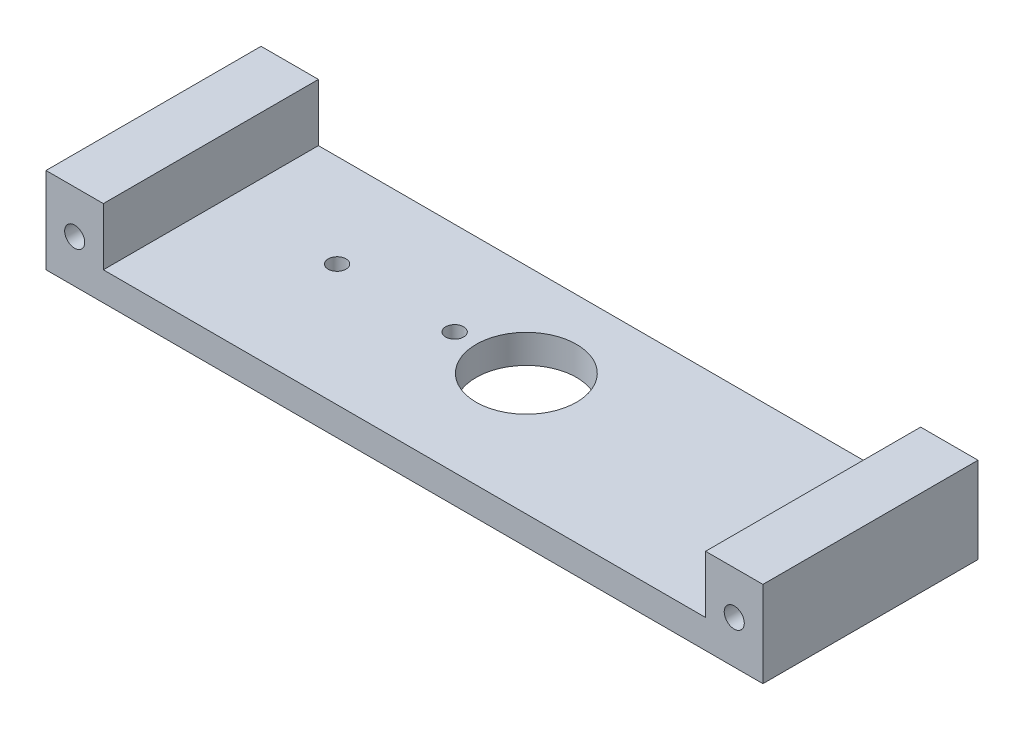
ISO-10303-21;
HEADER;
FILE_DESCRIPTION(('STEP AP214'),'2;1');
FILE_NAME('part.step','',(''),(''),'','','');
FILE_SCHEMA(('AUTOMOTIVE_DESIGN { 1 0 10303 214 1 1 1 1 }'));
ENDSEC;
DATA;
#1=APPLICATION_CONTEXT('core data for automotive mechanical design processes');
#2=APPLICATION_PROTOCOL_DEFINITION('international standard','automotive_design',2000,#1);
#3=PRODUCT_CONTEXT('',#1,'mechanical');
#4=PRODUCT('Part','Part','',(#3));
#5=PRODUCT_RELATED_PRODUCT_CATEGORY('part','',(#4));
#6=PRODUCT_DEFINITION_FORMATION('','',#4);
#7=PRODUCT_DEFINITION_CONTEXT('part definition',#1,'design');
#8=PRODUCT_DEFINITION('design','',#6,#7);
#9=PRODUCT_DEFINITION_SHAPE('','',#8);
#10=(LENGTH_UNIT() NAMED_UNIT(*) SI_UNIT(.MILLI.,.METRE.));
#11=(NAMED_UNIT(*) PLANE_ANGLE_UNIT() SI_UNIT($,.RADIAN.));
#12=(NAMED_UNIT(*) SI_UNIT($,.STERADIAN.) SOLID_ANGLE_UNIT());
#13=UNCERTAINTY_MEASURE_WITH_UNIT(LENGTH_MEASURE(1.E-05),#10,'distance_accuracy_value','');
#14=(GEOMETRIC_REPRESENTATION_CONTEXT(3) GLOBAL_UNCERTAINTY_ASSIGNED_CONTEXT((#13)) GLOBAL_UNIT_ASSIGNED_CONTEXT((#10,
#11,#12)) REPRESENTATION_CONTEXT('',''));
#15=CARTESIAN_POINT('',(0.,0.,0.));
#16=DIRECTION('',(0.,0.,1.));
#17=DIRECTION('',(1.,0.,0.));
#18=AXIS2_PLACEMENT_3D('',#15,#16,#17);
#19=CARTESIAN_POINT('',(0.,2.,0.));
#20=DIRECTION('',(0.,1.,0.));
#21=DIRECTION('',(0.,0.,1.));
#22=AXIS2_PLACEMENT_3D('',#19,#20,#21);
#23=PLANE('',#22);
#24=CARTESIAN_POINT('',(-53.0837928014307,2.,-8.1551724137931));
#25=DIRECTION('',(0.,1.,0.));
#26=DIRECTION('',(0.,0.,1.));
#27=AXIS2_PLACEMENT_3D('',#24,#25,#26);
#28=CIRCLE('',#27,0.625000000000001);
#29=CARTESIAN_POINT('',(-53.0837928014307,2.,-7.5301724137931));
#30=VERTEX_POINT('',#29);
#31=EDGE_CURVE('E243',#30,#30,#28,.T.);
#32=ORIENTED_EDGE('',*,*,#31,.F.);
#33=EDGE_LOOP('',(#32));
#34=FACE_BOUND('',#33,.T.);
#35=CARTESIAN_POINT('',(-44.8853811647955,2.,-8.1551724137931));
#36=DIRECTION('',(0.,1.,0.));
#37=DIRECTION('',(0.,0.,1.));
#38=AXIS2_PLACEMENT_3D('',#35,#36,#37);
#39=CIRCLE('',#38,0.625000000000001);
#40=CARTESIAN_POINT('',(-44.8853811647955,2.,-7.5301724137931));
#41=VERTEX_POINT('',#40);
#42=EDGE_CURVE('E237',#41,#41,#39,.T.);
#43=ORIENTED_EDGE('',*,*,#42,.F.);
#44=EDGE_LOOP('',(#43));
#45=FACE_BOUND('',#44,.T.);
#46=CARTESIAN_POINT('',(-39.8853811647955,2.,-8.1551724137931));
#47=DIRECTION('',(0.,1.,0.));
#48=DIRECTION('',(0.,0.,1.));
#49=AXIS2_PLACEMENT_3D('',#46,#47,#48);
#50=CIRCLE('',#49,3.49999999999999);
#51=CARTESIAN_POINT('',(-39.8853811647955,2.,-4.65517241379312));
#52=VERTEX_POINT('',#51);
#53=EDGE_CURVE('E184',#52,#52,#50,.T.);
#54=ORIENTED_EDGE('',*,*,#53,.F.);
#55=EDGE_LOOP('',(#54));
#56=FACE_BOUND('',#55,.T.);
#57=DIRECTION('',(1.,0.,0.));
#58=VECTOR('',#57,1.);
#59=CARTESIAN_POINT('',(-64.8853811647955,2.,0.344827586206898));
#60=LINE('',#59,#58);
#61=CARTESIAN_POINT('',(-60.8853811647955,2.,0.344827586206898));
#62=VERTEX_POINT('',#61);
#63=CARTESIAN_POINT('',(-18.8853811647955,2.,0.344827586206898));
#64=VERTEX_POINT('',#63);
#65=EDGE_CURVE('E119',#62,#64,#60,.T.);
#66=ORIENTED_EDGE('',*,*,#65,.T.);
#67=DIRECTION('',(0.,0.,1.));
#68=VECTOR('',#67,1.);
#69=CARTESIAN_POINT('',(-18.8853811647955,2.,-14.6551724137931));
#70=LINE('',#69,#68);
#71=CARTESIAN_POINT('',(-18.8853811647955,2.,-14.6551724137931));
#72=VERTEX_POINT('',#71);
#73=EDGE_CURVE('E108',#72,#64,#70,.T.);
#74=ORIENTED_EDGE('',*,*,#73,.F.);
#75=DIRECTION('',(-1.,0.,0.));
#76=VECTOR('',#75,1.);
#77=CARTESIAN_POINT('',(-64.8853811647955,2.,-14.6551724137931));
#78=LINE('',#77,#76);
#79=CARTESIAN_POINT('',(-60.8853811647955,2.,-14.6551724137931));
#80=VERTEX_POINT('',#79);
#81=EDGE_CURVE('E125',#72,#80,#78,.T.);
#82=ORIENTED_EDGE('',*,*,#81,.T.);
#83=DIRECTION('',(0.,0.,-1.));
#84=VECTOR('',#83,1.);
#85=CARTESIAN_POINT('',(-60.8853811647955,2.,-14.6551724137931));
#86=LINE('',#85,#84);
#87=EDGE_CURVE('E66',#62,#80,#86,.T.);
#88=ORIENTED_EDGE('',*,*,#87,.F.);
#89=EDGE_LOOP('',(#66,#74,#82,#88));
#90=FACE_BOUND('',#89,.T.);
#91=ADVANCED_FACE('F43',(#34,#45,#56,#90),#23,.T.);
#92=CARTESIAN_POINT('',(-14.8853811647955,2.,-14.6551724137931));
#93=DIRECTION('',(-1.,0.,0.));
#94=DIRECTION('',(0.,0.,1.));
#95=AXIS2_PLACEMENT_3D('',#92,#93,#94);
#96=PLANE('',#95);
#97=DIRECTION('',(0.,0.,-1.));
#98=VECTOR('',#97,1.);
#99=CARTESIAN_POINT('',(-14.8853811647955,0.,-14.6551724137931));
#100=LINE('',#99,#98);
#101=CARTESIAN_POINT('',(-14.8853811647955,0.,0.344827586206898));
#102=VERTEX_POINT('',#101);
#103=CARTESIAN_POINT('',(-14.8853811647955,0.,-14.6551724137931));
#104=VERTEX_POINT('',#103);
#105=EDGE_CURVE('E134',#102,#104,#100,.T.);
#106=ORIENTED_EDGE('',*,*,#105,.T.);
#107=DIRECTION('',(0.,-1.,0.));
#108=VECTOR('',#107,1.);
#109=CARTESIAN_POINT('',(-14.8853811647955,2.,-14.6551724137931));
#110=LINE('',#109,#108);
#111=CARTESIAN_POINT('',(-14.8853811647955,6.,-14.6551724137931));
#112=VERTEX_POINT('',#111);
#113=EDGE_CURVE('E11',#112,#104,#110,.T.);
#114=ORIENTED_EDGE('',*,*,#113,.F.);
#115=DIRECTION('',(0.,0.,-1.));
#116=VECTOR('',#115,1.);
#117=CARTESIAN_POINT('',(-14.8853811647955,6.,0.344827586206898));
#118=LINE('',#117,#116);
#119=CARTESIAN_POINT('',(-14.8853811647955,6.,0.344827586206898));
#120=VERTEX_POINT('',#119);
#121=EDGE_CURVE('E161',#120,#112,#118,.T.);
#122=ORIENTED_EDGE('',*,*,#121,.F.);
#123=DIRECTION('',(0.,-1.,0.));
#124=VECTOR('',#123,1.);
#125=CARTESIAN_POINT('',(-14.8853811647955,2.,0.344827586206898));
#126=LINE('',#125,#124);
#127=EDGE_CURVE('E124',#120,#102,#126,.T.);
#128=ORIENTED_EDGE('',*,*,#127,.T.);
#129=EDGE_LOOP('',(#106,#114,#122,#128));
#130=FACE_BOUND('',#129,.T.);
#131=ADVANCED_FACE('F45',(#130),#96,.F.);
#132=CARTESIAN_POINT('',(-64.8853811647955,2.,-14.6551724137931));
#133=DIRECTION('',(0.,0.,1.));
#134=DIRECTION('',(1.,0.,0.));
#135=AXIS2_PLACEMENT_3D('',#132,#133,#134);
#136=PLANE('',#135);
#137=CARTESIAN_POINT('',(-62.8853811647955,3.,-14.6551724137931));
#138=DIRECTION('',(0.,0.,-1.));
#139=DIRECTION('',(-1.,0.,0.));
#140=AXIS2_PLACEMENT_3D('',#137,#138,#139);
#141=CIRCLE('',#140,0.700000000000002);
#142=CARTESIAN_POINT('',(-63.5853811647955,3.,-14.6551724137931));
#143=VERTEX_POINT('',#142);
#144=EDGE_CURVE('E219',#143,#143,#141,.T.);
#145=ORIENTED_EDGE('',*,*,#144,.F.);
#146=EDGE_LOOP('',(#145));
#147=FACE_BOUND('',#146,.T.);
#148=CARTESIAN_POINT('',(-16.8853811647955,3.,-14.6551724137931));
#149=DIRECTION('',(0.,0.,-1.));
#150=DIRECTION('',(-1.,0.,0.));
#151=AXIS2_PLACEMENT_3D('',#148,#149,#150);
#152=CIRCLE('',#151,0.699999999999998);
#153=CARTESIAN_POINT('',(-17.5853811647955,3.,-14.6551724137931));
#154=VERTEX_POINT('',#153);
#155=EDGE_CURVE('E222',#154,#154,#152,.T.);
#156=ORIENTED_EDGE('',*,*,#155,.F.);
#157=EDGE_LOOP('',(#156));
#158=FACE_BOUND('',#157,.T.);
#159=DIRECTION('',(-1.,0.,0.));
#160=VECTOR('',#159,1.);
#161=CARTESIAN_POINT('',(-64.8853811647955,0.,-14.6551724137931));
#162=LINE('',#161,#160);
#163=CARTESIAN_POINT('',(-64.8853811647955,0.,-14.6551724137931));
#164=VERTEX_POINT('',#163);
#165=EDGE_CURVE('E137',#104,#164,#162,.T.);
#166=ORIENTED_EDGE('',*,*,#165,.T.);
#167=DIRECTION('',(0.,-1.,0.));
#168=VECTOR('',#167,1.);
#169=CARTESIAN_POINT('',(-64.8853811647955,2.,-14.6551724137931));
#170=LINE('',#169,#168);
#171=CARTESIAN_POINT('',(-64.8853811647955,6.,-14.6551724137931));
#172=VERTEX_POINT('',#171);
#173=EDGE_CURVE('E51',#172,#164,#170,.T.);
#174=ORIENTED_EDGE('',*,*,#173,.F.);
#175=DIRECTION('',(-1.,0.,0.));
#176=VECTOR('',#175,1.);
#177=CARTESIAN_POINT('',(-64.8853811647955,6.,-14.6551724137931));
#178=LINE('',#177,#176);
#179=CARTESIAN_POINT('',(-60.8853811647955,6.,-14.6551724137931));
#180=VERTEX_POINT('',#179);
#181=EDGE_CURVE('E173',#180,#172,#178,.T.);
#182=ORIENTED_EDGE('',*,*,#181,.F.);
#183=DIRECTION('',(0.,-1.,0.));
#184=VECTOR('',#183,1.);
#185=CARTESIAN_POINT('',(-60.8853811647955,6.,-14.6551724137931));
#186=LINE('',#185,#184);
#187=EDGE_CURVE('E181',#180,#80,#186,.T.);
#188=ORIENTED_EDGE('',*,*,#187,.T.);
#189=ORIENTED_EDGE('',*,*,#81,.F.);
#190=DIRECTION('',(0.,-1.,0.));
#191=VECTOR('',#190,1.);
#192=CARTESIAN_POINT('',(-18.8853811647955,6.,-14.6551724137931));
#193=LINE('',#192,#191);
#194=CARTESIAN_POINT('',(-18.8853811647955,6.,-14.6551724137931));
#195=VERTEX_POINT('',#194);
#196=EDGE_CURVE('E58',#195,#72,#193,.T.);
#197=ORIENTED_EDGE('',*,*,#196,.F.);
#198=DIRECTION('',(-1.,0.,0.));
#199=VECTOR('',#198,1.);
#200=CARTESIAN_POINT('',(-14.8853811647955,6.,-14.6551724137931));
#201=LINE('',#200,#199);
#202=EDGE_CURVE('E164',#112,#195,#201,.T.);
#203=ORIENTED_EDGE('',*,*,#202,.F.);
#204=ORIENTED_EDGE('',*,*,#113,.T.);
#205=EDGE_LOOP('',(#166,#174,#182,#188,#189,#197,#203,#204));
#206=FACE_BOUND('',#205,.T.);
#207=ADVANCED_FACE('F199',(#147,#158,#206),#136,.F.);
#208=CARTESIAN_POINT('',(-64.8853811647955,2.,-14.6551724137931));
#209=DIRECTION('',(1.,0.,0.));
#210=DIRECTION('',(0.,0.,-1.));
#211=AXIS2_PLACEMENT_3D('',#208,#209,#210);
#212=PLANE('',#211);
#213=DIRECTION('',(0.,0.,1.));
#214=VECTOR('',#213,1.);
#215=CARTESIAN_POINT('',(-64.8853811647955,0.,-14.6551724137931));
#216=LINE('',#215,#214);
#217=CARTESIAN_POINT('',(-64.8853811647955,0.,0.344827586206898));
#218=VERTEX_POINT('',#217);
#219=EDGE_CURVE('E140',#164,#218,#216,.T.);
#220=ORIENTED_EDGE('',*,*,#219,.T.);
#221=DIRECTION('',(0.,-1.,0.));
#222=VECTOR('',#221,1.);
#223=CARTESIAN_POINT('',(-64.8853811647955,2.,0.344827586206898));
#224=LINE('',#223,#222);
#225=CARTESIAN_POINT('',(-64.8853811647955,6.,0.344827586206898));
#226=VERTEX_POINT('',#225);
#227=EDGE_CURVE('E128',#226,#218,#224,.T.);
#228=ORIENTED_EDGE('',*,*,#227,.F.);
#229=DIRECTION('',(0.,0.,1.));
#230=VECTOR('',#229,1.);
#231=CARTESIAN_POINT('',(-64.8853811647955,6.,0.344827586206898));
#232=LINE('',#231,#230);
#233=EDGE_CURVE('E150',#172,#226,#232,.T.);
#234=ORIENTED_EDGE('',*,*,#233,.F.);
#235=ORIENTED_EDGE('',*,*,#173,.T.);
#236=EDGE_LOOP('',(#220,#228,#234,#235));
#237=FACE_BOUND('',#236,.T.);
#238=ADVANCED_FACE('F148',(#237),#212,.F.);
#239=CARTESIAN_POINT('',(-64.8853811647955,2.,0.344827586206898));
#240=DIRECTION('',(0.,0.,-1.));
#241=DIRECTION('',(-1.,0.,0.));
#242=AXIS2_PLACEMENT_3D('',#239,#240,#241);
#243=PLANE('',#242);
#244=CARTESIAN_POINT('',(-62.8853811647955,3.,0.344827586206898));
#245=DIRECTION('',(0.,0.,-1.));
#246=DIRECTION('',(-1.,0.,0.));
#247=AXIS2_PLACEMENT_3D('',#244,#245,#246);
#248=CIRCLE('',#247,0.700000000000002);
#249=CARTESIAN_POINT('',(-63.5853811647955,3.,0.344827586206898));
#250=VERTEX_POINT('',#249);
#251=EDGE_CURVE('E226',#250,#250,#248,.T.);
#252=ORIENTED_EDGE('',*,*,#251,.T.);
#253=EDGE_LOOP('',(#252));
#254=FACE_BOUND('',#253,.T.);
#255=CARTESIAN_POINT('',(-16.8853811647955,3.,0.344827586206898));
#256=DIRECTION('',(0.,0.,-1.));
#257=DIRECTION('',(-1.,0.,0.));
#258=AXIS2_PLACEMENT_3D('',#255,#256,#257);
#259=CIRCLE('',#258,0.699999999999998);
#260=CARTESIAN_POINT('',(-17.5853811647955,3.,0.344827586206898));
#261=VERTEX_POINT('',#260);
#262=EDGE_CURVE('E227',#261,#261,#259,.T.);
#263=ORIENTED_EDGE('',*,*,#262,.T.);
#264=EDGE_LOOP('',(#263));
#265=FACE_BOUND('',#264,.T.);
#266=DIRECTION('',(1.,0.,0.));
#267=VECTOR('',#266,1.);
#268=CARTESIAN_POINT('',(-64.8853811647955,0.,0.344827586206898));
#269=LINE('',#268,#267);
#270=EDGE_CURVE('E130',#218,#102,#269,.T.);
#271=ORIENTED_EDGE('',*,*,#270,.T.);
#272=ORIENTED_EDGE('',*,*,#127,.F.);
#273=DIRECTION('',(1.,0.,0.));
#274=VECTOR('',#273,1.);
#275=CARTESIAN_POINT('',(-18.8853811647955,6.,0.344827586206898));
#276=LINE('',#275,#274);
#277=CARTESIAN_POINT('',(-18.8853811647955,6.,0.344827586206898));
#278=VERTEX_POINT('',#277);
#279=EDGE_CURVE('E114',#278,#120,#276,.T.);
#280=ORIENTED_EDGE('',*,*,#279,.F.);
#281=DIRECTION('',(0.,-1.,0.));
#282=VECTOR('',#281,1.);
#283=CARTESIAN_POINT('',(-18.8853811647955,6.,0.344827586206898));
#284=LINE('',#283,#282);
#285=EDGE_CURVE('E111',#278,#64,#284,.T.);
#286=ORIENTED_EDGE('',*,*,#285,.T.);
#287=ORIENTED_EDGE('',*,*,#65,.F.);
#288=DIRECTION('',(0.,-1.,0.));
#289=VECTOR('',#288,1.);
#290=CARTESIAN_POINT('',(-60.8853811647955,6.,0.344827586206898));
#291=LINE('',#290,#289);
#292=CARTESIAN_POINT('',(-60.8853811647955,6.,0.344827586206898));
#293=VERTEX_POINT('',#292);
#294=EDGE_CURVE('E178',#293,#62,#291,.T.);
#295=ORIENTED_EDGE('',*,*,#294,.F.);
#296=DIRECTION('',(1.,0.,0.));
#297=VECTOR('',#296,1.);
#298=CARTESIAN_POINT('',(-60.8853811647955,6.,0.344827586206898));
#299=LINE('',#298,#297);
#300=EDGE_CURVE('E176',#226,#293,#299,.T.);
#301=ORIENTED_EDGE('',*,*,#300,.F.);
#302=ORIENTED_EDGE('',*,*,#227,.T.);
#303=EDGE_LOOP('',(#271,#272,#280,#286,#287,#295,#301,#302));
#304=FACE_BOUND('',#303,.T.);
#305=ADVANCED_FACE('F117',(#254,#265,#304),#243,.F.);
#306=CARTESIAN_POINT('',(0.,0.,0.));
#307=DIRECTION('',(0.,1.,0.));
#308=DIRECTION('',(0.,0.,1.));
#309=AXIS2_PLACEMENT_3D('',#306,#307,#308);
#310=PLANE('',#309);
#311=CARTESIAN_POINT('',(-53.0837928014307,0.,-8.1551724137931));
#312=DIRECTION('',(0.,1.,0.));
#313=DIRECTION('',(0.,0.,1.));
#314=AXIS2_PLACEMENT_3D('',#311,#312,#313);
#315=CIRCLE('',#314,0.625000000000001);
#316=CARTESIAN_POINT('',(-53.0837928014307,0.,-7.5301724137931));
#317=VERTEX_POINT('',#316);
#318=EDGE_CURVE('E240',#317,#317,#315,.T.);
#319=ORIENTED_EDGE('',*,*,#318,.T.);
#320=EDGE_LOOP('',(#319));
#321=FACE_BOUND('',#320,.T.);
#322=CARTESIAN_POINT('',(-44.8853811647955,0.,-8.1551724137931));
#323=DIRECTION('',(0.,1.,0.));
#324=DIRECTION('',(0.,0.,1.));
#325=AXIS2_PLACEMENT_3D('',#322,#323,#324);
#326=CIRCLE('',#325,0.625000000000001);
#327=CARTESIAN_POINT('',(-44.8853811647955,0.,-7.5301724137931));
#328=VERTEX_POINT('',#327);
#329=EDGE_CURVE('E230',#328,#328,#326,.T.);
#330=ORIENTED_EDGE('',*,*,#329,.T.);
#331=EDGE_LOOP('',(#330));
#332=FACE_BOUND('',#331,.T.);
#333=CARTESIAN_POINT('',(-39.8853811647955,0.,-8.1551724137931));
#334=DIRECTION('',(0.,1.,0.));
#335=DIRECTION('',(0.,0.,1.));
#336=AXIS2_PLACEMENT_3D('',#333,#334,#335);
#337=CIRCLE('',#336,3.49999999999999);
#338=CARTESIAN_POINT('',(-39.8853811647955,0.,-4.65517241379312));
#339=VERTEX_POINT('',#338);
#340=EDGE_CURVE('E138',#339,#339,#337,.T.);
#341=ORIENTED_EDGE('',*,*,#340,.T.);
#342=EDGE_LOOP('',(#341));
#343=FACE_BOUND('',#342,.T.);
#344=ORIENTED_EDGE('',*,*,#105,.F.);
#345=ORIENTED_EDGE('',*,*,#270,.F.);
#346=ORIENTED_EDGE('',*,*,#219,.F.);
#347=ORIENTED_EDGE('',*,*,#165,.F.);
#348=EDGE_LOOP('',(#344,#345,#346,#347));
#349=FACE_BOUND('',#348,.T.);
#350=ADVANCED_FACE('F156',(#321,#332,#343,#349),#310,.F.);
#351=CARTESIAN_POINT('',(-39.8853811647955,0.,-8.1551724137931));
#352=DIRECTION('',(0.,1.,0.));
#353=DIRECTION('',(0.,0.,1.));
#354=AXIS2_PLACEMENT_3D('',#351,#352,#353);
#355=CYLINDRICAL_SURFACE('',#354,3.49999999999999);
#356=ORIENTED_EDGE('',*,*,#340,.F.);
#357=EDGE_LOOP('',(#356));
#358=FACE_BOUND('',#357,.T.);
#359=ORIENTED_EDGE('',*,*,#53,.T.);
#360=EDGE_LOOP('',(#359));
#361=FACE_BOUND('',#360,.T.);
#362=ADVANCED_FACE('F189',(#358,#361),#355,.F.);
#363=CARTESIAN_POINT('',(-60.8853811647955,6.,-14.6551724137931));
#364=DIRECTION('',(-1.,0.,0.));
#365=DIRECTION('',(0.,0.,1.));
#366=AXIS2_PLACEMENT_3D('',#363,#364,#365);
#367=PLANE('',#366);
#368=ORIENTED_EDGE('',*,*,#87,.T.);
#369=ORIENTED_EDGE('',*,*,#187,.F.);
#370=DIRECTION('',(0.,0.,-1.));
#371=VECTOR('',#370,1.);
#372=CARTESIAN_POINT('',(-60.8853811647955,6.,-14.6551724137931));
#373=LINE('',#372,#371);
#374=EDGE_CURVE('E170',#293,#180,#373,.T.);
#375=ORIENTED_EDGE('',*,*,#374,.F.);
#376=ORIENTED_EDGE('',*,*,#294,.T.);
#377=EDGE_LOOP('',(#368,#369,#375,#376));
#378=FACE_BOUND('',#377,.T.);
#379=ADVANCED_FACE('F270',(#378),#367,.F.);
#380=CARTESIAN_POINT('',(0.,6.,0.));
#381=DIRECTION('',(0.,-1.,0.));
#382=DIRECTION('',(0.,0.,-1.));
#383=AXIS2_PLACEMENT_3D('',#380,#381,#382);
#384=PLANE('',#383);
#385=ORIENTED_EDGE('',*,*,#374,.T.);
#386=ORIENTED_EDGE('',*,*,#181,.T.);
#387=ORIENTED_EDGE('',*,*,#233,.T.);
#388=ORIENTED_EDGE('',*,*,#300,.T.);
#389=EDGE_LOOP('',(#385,#386,#387,#388));
#390=FACE_BOUND('',#389,.T.);
#391=ADVANCED_FACE('F267',(#390),#384,.F.);
#392=CARTESIAN_POINT('',(-18.8853811647955,6.,-14.6551724137931));
#393=DIRECTION('',(1.,0.,0.));
#394=DIRECTION('',(0.,0.,-1.));
#395=AXIS2_PLACEMENT_3D('',#392,#393,#394);
#396=PLANE('',#395);
#397=ORIENTED_EDGE('',*,*,#73,.T.);
#398=ORIENTED_EDGE('',*,*,#285,.F.);
#399=DIRECTION('',(0.,0.,1.));
#400=VECTOR('',#399,1.);
#401=CARTESIAN_POINT('',(-18.8853811647955,6.,-14.6551724137931));
#402=LINE('',#401,#400);
#403=EDGE_CURVE('E122',#195,#278,#402,.T.);
#404=ORIENTED_EDGE('',*,*,#403,.F.);
#405=ORIENTED_EDGE('',*,*,#196,.T.);
#406=EDGE_LOOP('',(#397,#398,#404,#405));
#407=FACE_BOUND('',#406,.T.);
#408=ADVANCED_FACE('F110',(#407),#396,.F.);
#409=CARTESIAN_POINT('',(0.,6.,0.));
#410=DIRECTION('',(0.,1.,0.));
#411=DIRECTION('',(0.,0.,1.));
#412=AXIS2_PLACEMENT_3D('',#409,#410,#411);
#413=PLANE('',#412);
#414=ORIENTED_EDGE('',*,*,#279,.T.);
#415=ORIENTED_EDGE('',*,*,#121,.T.);
#416=ORIENTED_EDGE('',*,*,#202,.T.);
#417=ORIENTED_EDGE('',*,*,#403,.T.);
#418=EDGE_LOOP('',(#414,#415,#416,#417));
#419=FACE_BOUND('',#418,.T.);
#420=ADVANCED_FACE('F166',(#419),#413,.T.);
#421=CARTESIAN_POINT('',(-16.8853811647955,3.,0.344827586206898));
#422=DIRECTION('',(0.,0.,-1.));
#423=DIRECTION('',(-1.,0.,0.));
#424=AXIS2_PLACEMENT_3D('',#421,#422,#423);
#425=CYLINDRICAL_SURFACE('',#424,0.699999999999998);
#426=ORIENTED_EDGE('',*,*,#262,.F.);
#427=EDGE_LOOP('',(#426));
#428=FACE_BOUND('',#427,.T.);
#429=ORIENTED_EDGE('',*,*,#155,.T.);
#430=EDGE_LOOP('',(#429));
#431=FACE_BOUND('',#430,.T.);
#432=ADVANCED_FACE('F260',(#428,#431),#425,.F.);
#433=CARTESIAN_POINT('',(-62.8853811647955,3.,0.344827586206898));
#434=DIRECTION('',(0.,0.,-1.));
#435=DIRECTION('',(-1.,0.,0.));
#436=AXIS2_PLACEMENT_3D('',#433,#434,#435);
#437=CYLINDRICAL_SURFACE('',#436,0.700000000000002);
#438=ORIENTED_EDGE('',*,*,#251,.F.);
#439=EDGE_LOOP('',(#438));
#440=FACE_BOUND('',#439,.T.);
#441=ORIENTED_EDGE('',*,*,#144,.T.);
#442=EDGE_LOOP('',(#441));
#443=FACE_BOUND('',#442,.T.);
#444=ADVANCED_FACE('F253',(#440,#443),#437,.F.);
#445=CARTESIAN_POINT('',(-44.8853811647955,2.,-8.1551724137931));
#446=DIRECTION('',(0.,1.,0.));
#447=DIRECTION('',(0.,0.,1.));
#448=AXIS2_PLACEMENT_3D('',#445,#446,#447);
#449=CYLINDRICAL_SURFACE('',#448,0.625000000000001);
#450=ORIENTED_EDGE('',*,*,#329,.F.);
#451=EDGE_LOOP('',(#450));
#452=FACE_BOUND('',#451,.T.);
#453=ORIENTED_EDGE('',*,*,#42,.T.);
#454=EDGE_LOOP('',(#453));
#455=FACE_BOUND('',#454,.T.);
#456=ADVANCED_FACE('F248',(#452,#455),#449,.F.);
#457=CARTESIAN_POINT('',(-53.0837928014307,2.,-8.1551724137931));
#458=DIRECTION('',(0.,1.,0.));
#459=DIRECTION('',(0.,0.,1.));
#460=AXIS2_PLACEMENT_3D('',#457,#458,#459);
#461=CYLINDRICAL_SURFACE('',#460,0.625000000000001);
#462=ORIENTED_EDGE('',*,*,#318,.F.);
#463=EDGE_LOOP('',(#462));
#464=FACE_BOUND('',#463,.T.);
#465=ORIENTED_EDGE('',*,*,#31,.T.);
#466=EDGE_LOOP('',(#465));
#467=FACE_BOUND('',#466,.T.);
#468=ADVANCED_FACE('F246',(#464,#467),#461,.F.);
#469=CLOSED_SHELL('',(#91,#131,#207,#238,#305,#350,#362,#379,#391,#408,#420,#432,#444,#456,#468));
#470=MANIFOLD_SOLID_BREP('B2',#469);
#471=ADVANCED_BREP_SHAPE_REPRESENTATION('',(#18,#470),#14);
#472=SHAPE_DEFINITION_REPRESENTATION(#9,#471);
ENDSEC;
END-ISO-10303-21;
